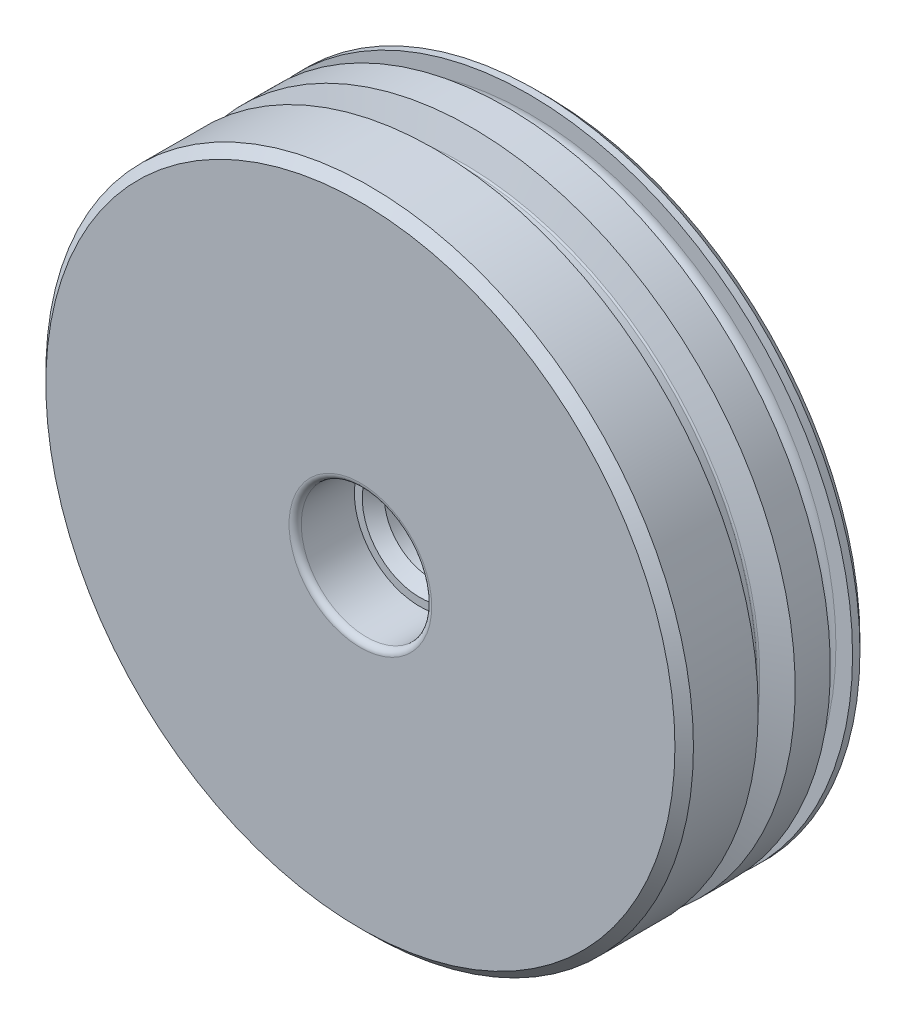
ISO-10303-21;
HEADER;
FILE_DESCRIPTION(('STEP AP214'),'2;1');
FILE_NAME('part.step','',(''),(''),'','','');
FILE_SCHEMA(('AUTOMOTIVE_DESIGN { 1 0 10303 214 1 1 1 1 }'));
ENDSEC;
DATA;
#1=APPLICATION_CONTEXT('core data for automotive mechanical design processes');
#2=APPLICATION_PROTOCOL_DEFINITION('international standard','automotive_design',2000,#1);
#3=PRODUCT_CONTEXT('',#1,'mechanical');
#4=PRODUCT('Part','Part','',(#3));
#5=PRODUCT_RELATED_PRODUCT_CATEGORY('part','',(#4));
#6=PRODUCT_DEFINITION_FORMATION('','',#4);
#7=PRODUCT_DEFINITION_CONTEXT('part definition',#1,'design');
#8=PRODUCT_DEFINITION('design','',#6,#7);
#9=PRODUCT_DEFINITION_SHAPE('','',#8);
#10=(LENGTH_UNIT() NAMED_UNIT(*) SI_UNIT(.MILLI.,.METRE.));
#11=(NAMED_UNIT(*) PLANE_ANGLE_UNIT() SI_UNIT($,.RADIAN.));
#12=(NAMED_UNIT(*) SI_UNIT($,.STERADIAN.) SOLID_ANGLE_UNIT());
#13=UNCERTAINTY_MEASURE_WITH_UNIT(LENGTH_MEASURE(1.E-05),#10,'distance_accuracy_value','');
#14=(GEOMETRIC_REPRESENTATION_CONTEXT(3) GLOBAL_UNCERTAINTY_ASSIGNED_CONTEXT((#13)) GLOBAL_UNIT_ASSIGNED_CONTEXT((#10,
#11,#12)) REPRESENTATION_CONTEXT('',''));
#15=CARTESIAN_POINT('',(0.,0.,0.));
#16=DIRECTION('',(0.,0.,1.));
#17=DIRECTION('',(1.,0.,0.));
#18=AXIS2_PLACEMENT_3D('',#15,#16,#17);
#19=CARTESIAN_POINT('',(0.,0.,-5.));
#20=DIRECTION('',(0.,0.,1.));
#21=DIRECTION('',(1.,0.,0.));
#22=AXIS2_PLACEMENT_3D('',#19,#20,#21);
#23=CYLINDRICAL_SURFACE('',#22,17.5);
#24=CARTESIAN_POINT('',(0.,0.,-4.09999999999999));
#25=DIRECTION('',(0.,0.,-1.));
#26=DIRECTION('',(-1.,0.,0.));
#27=AXIS2_PLACEMENT_3D('',#24,#25,#26);
#28=CIRCLE('',#27,17.5);
#29=CARTESIAN_POINT('',(-17.5,0.,-4.09999999999999));
#30=VERTEX_POINT('',#29);
#31=EDGE_CURVE('E176',#30,#30,#28,.T.);
#32=ORIENTED_EDGE('',*,*,#31,.T.);
#33=EDGE_LOOP('',(#32));
#34=FACE_BOUND('',#33,.T.);
#35=CARTESIAN_POINT('',(0.,0.,-4.49999999999999));
#36=DIRECTION('',(0.,0.,1.));
#37=DIRECTION('',(1.,0.,0.));
#38=AXIS2_PLACEMENT_3D('',#35,#36,#37);
#39=CIRCLE('',#38,17.5);
#40=CARTESIAN_POINT('',(17.5,0.,-4.49999999999999));
#41=VERTEX_POINT('',#40);
#42=EDGE_CURVE('E203',#41,#41,#39,.T.);
#43=ORIENTED_EDGE('',*,*,#42,.T.);
#44=EDGE_LOOP('',(#43));
#45=FACE_BOUND('',#44,.T.);
#46=ADVANCED_FACE('F34',(#34,#45),#23,.T.);
#47=CARTESIAN_POINT('',(0.,0.,-5.));
#48=DIRECTION('',(0.,0.,1.));
#49=DIRECTION('',(1.,0.,0.));
#50=AXIS2_PLACEMENT_3D('',#47,#48,#49);
#51=CYLINDRICAL_SURFACE('',#50,2.5);
#52=CARTESIAN_POINT('',(0.,0.,-1.2));
#53=DIRECTION('',(0.,0.,-1.));
#54=DIRECTION('',(-1.,0.,0.));
#55=AXIS2_PLACEMENT_3D('',#52,#53,#54);
#56=CIRCLE('',#55,2.5);
#57=CARTESIAN_POINT('',(-2.5,0.,-1.2));
#58=VERTEX_POINT('',#57);
#59=EDGE_CURVE('E224',#58,#58,#56,.T.);
#60=ORIENTED_EDGE('',*,*,#59,.T.);
#61=EDGE_LOOP('',(#60));
#62=FACE_BOUND('',#61,.T.);
#63=CARTESIAN_POINT('',(0.,0.,1.19999999999999));
#64=DIRECTION('',(0.,0.,1.));
#65=DIRECTION('',(1.,0.,0.));
#66=AXIS2_PLACEMENT_3D('',#63,#64,#65);
#67=CIRCLE('',#66,2.5);
#68=CARTESIAN_POINT('',(2.5,0.,1.19999999999999));
#69=VERTEX_POINT('',#68);
#70=EDGE_CURVE('E215',#69,#69,#67,.T.);
#71=ORIENTED_EDGE('',*,*,#70,.T.);
#72=EDGE_LOOP('',(#71));
#73=FACE_BOUND('',#72,.T.);
#74=ADVANCED_FACE('F252',(#62,#73),#51,.F.);
#75=CARTESIAN_POINT('',(0.,0.,4.49999999999999));
#76=DIRECTION('',(0.,0.,1.));
#77=DIRECTION('',(1.,0.,0.));
#78=AXIS2_PLACEMENT_3D('',#75,#76,#77);
#79=CIRCLE('',#78,17.5);
#80=CARTESIAN_POINT('',(17.5,0.,4.49999999999999));
#81=VERTEX_POINT('',#80);
#82=EDGE_CURVE('E212',#81,#81,#79,.F.);
#83=ORIENTED_EDGE('',*,*,#82,.T.);
#84=EDGE_LOOP('',(#83));
#85=FACE_BOUND('',#84,.T.);
#86=CARTESIAN_POINT('',(0.,0.,1.));
#87=DIRECTION('',(0.,0.,-1.));
#88=DIRECTION('',(-1.,0.,0.));
#89=AXIS2_PLACEMENT_3D('',#86,#87,#88);
#90=CIRCLE('',#89,17.5);
#91=CARTESIAN_POINT('',(-17.5,0.,1.));
#92=VERTEX_POINT('',#91);
#93=EDGE_CURVE('E200',#92,#92,#90,.T.);
#94=ORIENTED_EDGE('',*,*,#93,.F.);
#95=EDGE_LOOP('',(#94));
#96=FACE_BOUND('',#95,.T.);
#97=ADVANCED_FACE('F255',(#85,#96),#23,.T.);
#98=CARTESIAN_POINT('',(0.,0.,5.));
#99=DIRECTION('',(0.,0.,1.));
#100=DIRECTION('',(1.,0.,0.));
#101=AXIS2_PLACEMENT_3D('',#98,#99,#100);
#102=PLANE('',#101);
#103=CARTESIAN_POINT('',(0.,0.,5.));
#104=DIRECTION('',(0.,0.,1.));
#105=DIRECTION('',(1.,0.,0.));
#106=AXIS2_PLACEMENT_3D('',#103,#104,#105);
#107=CIRCLE('',#106,3.855);
#108=CARTESIAN_POINT('',(3.855,0.,5.));
#109=VERTEX_POINT('',#108);
#110=EDGE_CURVE('E230',#109,#109,#107,.F.);
#111=ORIENTED_EDGE('',*,*,#110,.T.);
#112=EDGE_LOOP('',(#111));
#113=FACE_BOUND('',#112,.T.);
#114=CARTESIAN_POINT('',(0.,0.,5.));
#115=DIRECTION('',(0.,0.,1.));
#116=DIRECTION('',(1.,0.,0.));
#117=AXIS2_PLACEMENT_3D('',#114,#115,#116);
#118=CIRCLE('',#117,17.);
#119=CARTESIAN_POINT('',(17.,0.,5.));
#120=VERTEX_POINT('',#119);
#121=EDGE_CURVE('E209',#120,#120,#118,.T.);
#122=ORIENTED_EDGE('',*,*,#121,.T.);
#123=EDGE_LOOP('',(#122));
#124=FACE_BOUND('',#123,.T.);
#125=ADVANCED_FACE('F266',(#113,#124),#102,.T.);
#126=CARTESIAN_POINT('',(0.,0.,1.));
#127=DIRECTION('',(0.,0.,1.));
#128=DIRECTION('',(1.,0.,0.));
#129=AXIS2_PLACEMENT_3D('',#126,#127,#128);
#130=CONICAL_SURFACE('',#129,17.5,1.24904577239826);
#131=CARTESIAN_POINT('',(0.,0.,0.522792407799439));
#132=DIRECTION('',(0.,0.,-1.));
#133=DIRECTION('',(-1.,0.,0.));
#134=AXIS2_PLACEMENT_3D('',#131,#132,#133);
#135=CIRCLE('',#134,16.0683772233983);
#136=CARTESIAN_POINT('',(-16.0683772233983,0.,0.522792407799439));
#137=VERTEX_POINT('',#136);
#138=EDGE_CURVE('E197',#137,#137,#135,.T.);
#139=ORIENTED_EDGE('',*,*,#138,.F.);
#140=EDGE_LOOP('',(#139));
#141=FACE_BOUND('',#140,.T.);
#142=ORIENTED_EDGE('',*,*,#93,.T.);
#143=EDGE_LOOP('',(#142));
#144=FACE_BOUND('',#143,.T.);
#145=ADVANCED_FACE('F304',(#141,#144),#130,.T.);
#146=CARTESIAN_POINT('',(0.,0.,0.427924077994387));
#147=DIRECTION('',(0.,0.,-1.));
#148=DIRECTION('',(-1.,0.,0.));
#149=AXIS2_PLACEMENT_3D('',#146,#147,#148);
#150=TOROIDAL_SURFACE('',#149,16.1,0.1);
#151=CARTESIAN_POINT('',(0.,0.,0.427924077994387));
#152=DIRECTION('',(0.,0.,-1.));
#153=DIRECTION('',(-1.,0.,0.));
#154=AXIS2_PLACEMENT_3D('',#151,#152,#153);
#155=CIRCLE('',#154,16.);
#156=CARTESIAN_POINT('',(-16.,0.,0.427924077994387));
#157=VERTEX_POINT('',#156);
#158=EDGE_CURVE('E194',#157,#157,#155,.T.);
#159=ORIENTED_EDGE('',*,*,#158,.F.);
#160=EDGE_LOOP('',(#159));
#161=FACE_BOUND('',#160,.T.);
#162=ORIENTED_EDGE('',*,*,#138,.T.);
#163=EDGE_LOOP('',(#162));
#164=FACE_BOUND('',#163,.T.);
#165=ADVANCED_FACE('F298',(#161,#164),#150,.F.);
#166=CARTESIAN_POINT('',(0.,0.,-0.35));
#167=DIRECTION('',(0.,0.,-1.));
#168=DIRECTION('',(-1.,0.,0.));
#169=AXIS2_PLACEMENT_3D('',#166,#167,#168);
#170=CYLINDRICAL_SURFACE('',#169,16.);
#171=CARTESIAN_POINT('',(0.,0.,-0.427924077994387));
#172=DIRECTION('',(0.,0.,-1.));
#173=DIRECTION('',(-1.,0.,0.));
#174=AXIS2_PLACEMENT_3D('',#171,#172,#173);
#175=CIRCLE('',#174,16.);
#176=CARTESIAN_POINT('',(-16.,0.,-0.427924077994387));
#177=VERTEX_POINT('',#176);
#178=EDGE_CURVE('E191',#177,#177,#175,.T.);
#179=ORIENTED_EDGE('',*,*,#178,.F.);
#180=EDGE_LOOP('',(#179));
#181=FACE_BOUND('',#180,.T.);
#182=ORIENTED_EDGE('',*,*,#158,.T.);
#183=EDGE_LOOP('',(#182));
#184=FACE_BOUND('',#183,.T.);
#185=ADVANCED_FACE('F292',(#181,#184),#170,.T.);
#186=CARTESIAN_POINT('',(0.,0.,-0.427924077994387));
#187=DIRECTION('',(0.,0.,-1.));
#188=DIRECTION('',(-1.,0.,0.));
#189=AXIS2_PLACEMENT_3D('',#186,#187,#188);
#190=TOROIDAL_SURFACE('',#189,16.1,0.1);
#191=CARTESIAN_POINT('',(0.,0.,-0.522792407799438));
#192=DIRECTION('',(0.,0.,-1.));
#193=DIRECTION('',(-1.,0.,0.));
#194=AXIS2_PLACEMENT_3D('',#191,#192,#193);
#195=CIRCLE('',#194,16.0683772233983);
#196=CARTESIAN_POINT('',(-16.0683772233983,0.,-0.522792407799438));
#197=VERTEX_POINT('',#196);
#198=EDGE_CURVE('E188',#197,#197,#195,.T.);
#199=ORIENTED_EDGE('',*,*,#198,.F.);
#200=EDGE_LOOP('',(#199));
#201=FACE_BOUND('',#200,.T.);
#202=ORIENTED_EDGE('',*,*,#178,.T.);
#203=EDGE_LOOP('',(#202));
#204=FACE_BOUND('',#203,.T.);
#205=ADVANCED_FACE('F286',(#201,#204),#190,.F.);
#206=CARTESIAN_POINT('',(0.,0.,-0.522792407799438));
#207=DIRECTION('',(0.,0.,-1.));
#208=DIRECTION('',(-1.,0.,0.));
#209=AXIS2_PLACEMENT_3D('',#206,#207,#208);
#210=CONICAL_SURFACE('',#209,16.0683772233983,1.24904577239825);
#211=CARTESIAN_POINT('',(0.,0.,-1.));
#212=DIRECTION('',(0.,0.,-1.));
#213=DIRECTION('',(-1.,0.,0.));
#214=AXIS2_PLACEMENT_3D('',#211,#212,#213);
#215=CIRCLE('',#214,17.5);
#216=CARTESIAN_POINT('',(-17.5,0.,-1.));
#217=VERTEX_POINT('',#216);
#218=EDGE_CURVE('E185',#217,#217,#215,.T.);
#219=ORIENTED_EDGE('',*,*,#218,.F.);
#220=EDGE_LOOP('',(#219));
#221=FACE_BOUND('',#220,.T.);
#222=ORIENTED_EDGE('',*,*,#198,.T.);
#223=EDGE_LOOP('',(#222));
#224=FACE_BOUND('',#223,.T.);
#225=ADVANCED_FACE('F278',(#221,#224),#210,.T.);
#226=CARTESIAN_POINT('',(0.,0.,-5.));
#227=DIRECTION('',(0.,0.,1.));
#228=DIRECTION('',(1.,0.,0.));
#229=AXIS2_PLACEMENT_3D('',#226,#227,#228);
#230=PLANE('',#229);
#231=DIRECTION('',(-1.,0.,0.));
#232=VECTOR('',#231,1.);
#233=CARTESIAN_POINT('',(4.45,-1.55,-5.));
#234=LINE('',#233,#232);
#235=CARTESIAN_POINT('',(7.55,-1.55,-5.));
#236=VERTEX_POINT('',#235);
#237=CARTESIAN_POINT('',(4.45,-1.55,-5.));
#238=VERTEX_POINT('',#237);
#239=EDGE_CURVE('E128',#236,#238,#234,.T.);
#240=ORIENTED_EDGE('',*,*,#239,.F.);
#241=DIRECTION('',(0.,-1.,0.));
#242=VECTOR('',#241,1.);
#243=CARTESIAN_POINT('',(7.55,1.55,-5.));
#244=LINE('',#243,#242);
#245=CARTESIAN_POINT('',(7.55,1.55,-5.));
#246=VERTEX_POINT('',#245);
#247=EDGE_CURVE('E49',#246,#236,#244,.T.);
#248=ORIENTED_EDGE('',*,*,#247,.F.);
#249=DIRECTION('',(1.,0.,0.));
#250=VECTOR('',#249,1.);
#251=CARTESIAN_POINT('',(4.45,1.55,-5.));
#252=LINE('',#251,#250);
#253=CARTESIAN_POINT('',(4.45,1.55,-5.));
#254=VERTEX_POINT('',#253);
#255=EDGE_CURVE('E119',#254,#246,#252,.T.);
#256=ORIENTED_EDGE('',*,*,#255,.F.);
#257=DIRECTION('',(0.,1.,0.));
#258=VECTOR('',#257,1.);
#259=CARTESIAN_POINT('',(4.45,1.55,-5.));
#260=LINE('',#259,#258);
#261=EDGE_CURVE('E122',#238,#254,#260,.T.);
#262=ORIENTED_EDGE('',*,*,#261,.F.);
#263=EDGE_LOOP('',(#240,#248,#256,#262));
#264=FACE_BOUND('',#263,.T.);
#265=DIRECTION('',(-1.,0.,0.));
#266=VECTOR('',#265,1.);
#267=CARTESIAN_POINT('',(-7.55,-1.55,-5.));
#268=LINE('',#267,#266);
#269=CARTESIAN_POINT('',(-4.45,-1.55,-5.));
#270=VERTEX_POINT('',#269);
#271=CARTESIAN_POINT('',(-7.55,-1.55,-5.));
#272=VERTEX_POINT('',#271);
#273=EDGE_CURVE('E152',#270,#272,#268,.T.);
#274=ORIENTED_EDGE('',*,*,#273,.F.);
#275=DIRECTION('',(0.,-1.,0.));
#276=VECTOR('',#275,1.);
#277=CARTESIAN_POINT('',(-4.45,1.55,-5.));
#278=LINE('',#277,#276);
#279=CARTESIAN_POINT('',(-4.45,1.55,-5.));
#280=VERTEX_POINT('',#279);
#281=EDGE_CURVE('E57',#280,#270,#278,.T.);
#282=ORIENTED_EDGE('',*,*,#281,.F.);
#283=DIRECTION('',(1.,0.,0.));
#284=VECTOR('',#283,1.);
#285=CARTESIAN_POINT('',(-7.55,1.55,-5.));
#286=LINE('',#285,#284);
#287=CARTESIAN_POINT('',(-7.55,1.55,-5.));
#288=VERTEX_POINT('',#287);
#289=EDGE_CURVE('E141',#288,#280,#286,.T.);
#290=ORIENTED_EDGE('',*,*,#289,.F.);
#291=DIRECTION('',(0.,1.,0.));
#292=VECTOR('',#291,1.);
#293=CARTESIAN_POINT('',(-7.55,1.55,-5.));
#294=LINE('',#293,#292);
#295=EDGE_CURVE('E155',#272,#288,#294,.T.);
#296=ORIENTED_EDGE('',*,*,#295,.F.);
#297=EDGE_LOOP('',(#274,#282,#290,#296));
#298=FACE_BOUND('',#297,.T.);
#299=CARTESIAN_POINT('',(0.,0.,-5.));
#300=DIRECTION('',(0.,0.,1.));
#301=DIRECTION('',(1.,0.,0.));
#302=AXIS2_PLACEMENT_3D('',#299,#300,#301);
#303=CIRCLE('',#302,3.855);
#304=CARTESIAN_POINT('',(3.855,0.,-5.));
#305=VERTEX_POINT('',#304);
#306=EDGE_CURVE('E42',#305,#305,#303,.T.);
#307=ORIENTED_EDGE('',*,*,#306,.T.);
#308=EDGE_LOOP('',(#307));
#309=FACE_BOUND('',#308,.T.);
#310=CARTESIAN_POINT('',(0.,0.,-5.));
#311=DIRECTION('',(0.,0.,1.));
#312=DIRECTION('',(1.,0.,0.));
#313=AXIS2_PLACEMENT_3D('',#310,#311,#312);
#314=CIRCLE('',#313,17.);
#315=CARTESIAN_POINT('',(17.,0.,-5.));
#316=VERTEX_POINT('',#315);
#317=EDGE_CURVE('E206',#316,#316,#314,.F.);
#318=ORIENTED_EDGE('',*,*,#317,.T.);
#319=EDGE_LOOP('',(#318));
#320=FACE_BOUND('',#319,.T.);
#321=ADVANCED_FACE('F235',(#264,#298,#309,#320),#230,.F.);
#322=CARTESIAN_POINT('',(0.,0.,-2.89999999999999));
#323=DIRECTION('',(0.,0.,-1.));
#324=DIRECTION('',(-1.,0.,0.));
#325=AXIS2_PLACEMENT_3D('',#322,#323,#324);
#326=CIRCLE('',#325,17.5);
#327=CARTESIAN_POINT('',(-17.5,0.,-2.89999999999999));
#328=VERTEX_POINT('',#327);
#329=EDGE_CURVE('E173',#328,#328,#326,.T.);
#330=ORIENTED_EDGE('',*,*,#329,.F.);
#331=EDGE_LOOP('',(#330));
#332=FACE_BOUND('',#331,.T.);
#333=ORIENTED_EDGE('',*,*,#218,.T.);
#334=EDGE_LOOP('',(#333));
#335=FACE_BOUND('',#334,.T.);
#336=ADVANCED_FACE('F256',(#332,#335),#23,.T.);
#337=CARTESIAN_POINT('',(0.,0.,1.8));
#338=DIRECTION('',(0.,0.,1.));
#339=DIRECTION('',(1.,0.,0.));
#340=AXIS2_PLACEMENT_3D('',#337,#338,#339);
#341=CYLINDRICAL_SURFACE('',#340,3.525);
#342=CARTESIAN_POINT('',(0.,0.,4.67));
#343=DIRECTION('',(0.,0.,1.));
#344=DIRECTION('',(1.,0.,0.));
#345=AXIS2_PLACEMENT_3D('',#342,#343,#344);
#346=CIRCLE('',#345,3.525);
#347=CARTESIAN_POINT('',(3.525,0.,4.67));
#348=VERTEX_POINT('',#347);
#349=EDGE_CURVE('E227',#348,#348,#346,.T.);
#350=ORIENTED_EDGE('',*,*,#349,.T.);
#351=EDGE_LOOP('',(#350));
#352=FACE_BOUND('',#351,.T.);
#353=CARTESIAN_POINT('',(0.,0.,1.8));
#354=DIRECTION('',(0.,0.,1.));
#355=DIRECTION('',(1.,0.,0.));
#356=AXIS2_PLACEMENT_3D('',#353,#354,#355);
#357=CIRCLE('',#356,3.525);
#358=CARTESIAN_POINT('',(3.525,0.,1.8));
#359=VERTEX_POINT('',#358);
#360=EDGE_CURVE('E182',#359,#359,#357,.T.);
#361=ORIENTED_EDGE('',*,*,#360,.F.);
#362=EDGE_LOOP('',(#361));
#363=FACE_BOUND('',#362,.T.);
#364=ADVANCED_FACE('F269',(#352,#363),#341,.F.);
#365=CARTESIAN_POINT('',(0.,0.,1.8));
#366=DIRECTION('',(0.,0.,1.));
#367=DIRECTION('',(1.,0.,0.));
#368=AXIS2_PLACEMENT_3D('',#365,#366,#367);
#369=PLANE('',#368);
#370=CARTESIAN_POINT('',(0.,0.,1.8));
#371=DIRECTION('',(0.,0.,1.));
#372=DIRECTION('',(1.,0.,0.));
#373=AXIS2_PLACEMENT_3D('',#370,#371,#372);
#374=CIRCLE('',#373,3.10000000000001);
#375=CARTESIAN_POINT('',(3.10000000000001,0.,1.8));
#376=VERTEX_POINT('',#375);
#377=EDGE_CURVE('E218',#376,#376,#374,.F.);
#378=ORIENTED_EDGE('',*,*,#377,.T.);
#379=EDGE_LOOP('',(#378));
#380=FACE_BOUND('',#379,.T.);
#381=ORIENTED_EDGE('',*,*,#360,.T.);
#382=EDGE_LOOP('',(#381));
#383=FACE_BOUND('',#382,.T.);
#384=ADVANCED_FACE('F275',(#380,#383),#369,.T.);
#385=CARTESIAN_POINT('',(0.,0.,-4.49999999999999));
#386=DIRECTION('',(0.,0.,1.));
#387=DIRECTION('',(1.,0.,0.));
#388=AXIS2_PLACEMENT_3D('',#385,#386,#387);
#389=CONICAL_SURFACE('',#388,17.5,0.785398163397448);
#390=ORIENTED_EDGE('',*,*,#317,.F.);
#391=EDGE_LOOP('',(#390));
#392=FACE_BOUND('',#391,.T.);
#393=ORIENTED_EDGE('',*,*,#42,.F.);
#394=EDGE_LOOP('',(#393));
#395=FACE_BOUND('',#394,.T.);
#396=ADVANCED_FACE('F320',(#392,#395),#389,.T.);
#397=CARTESIAN_POINT('',(0.,0.,5.));
#398=DIRECTION('',(0.,0.,-1.));
#399=DIRECTION('',(-1.,0.,0.));
#400=AXIS2_PLACEMENT_3D('',#397,#398,#399);
#401=CONICAL_SURFACE('',#400,17.,0.785398163397441);
#402=ORIENTED_EDGE('',*,*,#82,.F.);
#403=EDGE_LOOP('',(#402));
#404=FACE_BOUND('',#403,.T.);
#405=ORIENTED_EDGE('',*,*,#121,.F.);
#406=EDGE_LOOP('',(#405));
#407=FACE_BOUND('',#406,.T.);
#408=ADVANCED_FACE('F503',(#404,#407),#401,.T.);
#409=CARTESIAN_POINT('',(0.,0.,1.19999999999999));
#410=DIRECTION('',(0.,0.,1.));
#411=DIRECTION('',(1.,0.,0.));
#412=AXIS2_PLACEMENT_3D('',#409,#410,#411);
#413=CONICAL_SURFACE('',#412,2.5,0.785398163397452);
#414=ORIENTED_EDGE('',*,*,#377,.F.);
#415=EDGE_LOOP('',(#414));
#416=FACE_BOUND('',#415,.T.);
#417=ORIENTED_EDGE('',*,*,#70,.F.);
#418=EDGE_LOOP('',(#417));
#419=FACE_BOUND('',#418,.T.);
#420=ADVANCED_FACE('F331',(#416,#419),#413,.F.);
#421=CARTESIAN_POINT('',(0.,0.,-1.8));
#422=DIRECTION('',(0.,0.,-1.));
#423=DIRECTION('',(1.,0.,0.));
#424=AXIS2_PLACEMENT_3D('',#421,#422,#423);
#425=PLANE('',#424);
#426=CARTESIAN_POINT('',(0.,0.,-1.8));
#427=DIRECTION('',(0.,0.,-1.));
#428=DIRECTION('',(-1.,0.,0.));
#429=AXIS2_PLACEMENT_3D('',#426,#427,#428);
#430=CIRCLE('',#429,3.10000000000001);
#431=CARTESIAN_POINT('',(-3.10000000000001,0.,-1.8));
#432=VERTEX_POINT('',#431);
#433=EDGE_CURVE('E221',#432,#432,#430,.F.);
#434=ORIENTED_EDGE('',*,*,#433,.T.);
#435=EDGE_LOOP('',(#434));
#436=FACE_BOUND('',#435,.T.);
#437=CARTESIAN_POINT('',(0.,0.,-1.8));
#438=DIRECTION('',(0.,0.,1.));
#439=DIRECTION('',(1.,0.,0.));
#440=AXIS2_PLACEMENT_3D('',#437,#438,#439);
#441=CIRCLE('',#440,3.525);
#442=CARTESIAN_POINT('',(3.525,0.,-1.8));
#443=VERTEX_POINT('',#442);
#444=EDGE_CURVE('E179',#443,#443,#441,.T.);
#445=ORIENTED_EDGE('',*,*,#444,.F.);
#446=EDGE_LOOP('',(#445));
#447=FACE_BOUND('',#446,.T.);
#448=ADVANCED_FACE('F327',(#436,#447),#425,.T.);
#449=CARTESIAN_POINT('',(0.,0.,-1.8));
#450=DIRECTION('',(0.,0.,-1.));
#451=DIRECTION('',(-1.,0.,0.));
#452=AXIS2_PLACEMENT_3D('',#449,#450,#451);
#453=CYLINDRICAL_SURFACE('',#452,3.525);
#454=CARTESIAN_POINT('',(0.,0.,-4.67));
#455=DIRECTION('',(0.,0.,1.));
#456=DIRECTION('',(1.,0.,0.));
#457=AXIS2_PLACEMENT_3D('',#454,#455,#456);
#458=CIRCLE('',#457,3.525);
#459=CARTESIAN_POINT('',(3.525,0.,-4.67));
#460=VERTEX_POINT('',#459);
#461=EDGE_CURVE('E11',#460,#460,#458,.F.);
#462=ORIENTED_EDGE('',*,*,#461,.T.);
#463=EDGE_LOOP('',(#462));
#464=FACE_BOUND('',#463,.T.);
#465=ORIENTED_EDGE('',*,*,#444,.T.);
#466=EDGE_LOOP('',(#465));
#467=FACE_BOUND('',#466,.T.);
#468=ADVANCED_FACE('F323',(#464,#467),#453,.F.);
#469=CARTESIAN_POINT('',(0.,0.,-1.8));
#470=DIRECTION('',(0.,0.,-1.));
#471=DIRECTION('',(-1.,0.,0.));
#472=AXIS2_PLACEMENT_3D('',#469,#470,#471);
#473=CONICAL_SURFACE('',#472,3.10000000000001,0.785398163397454);
#474=ORIENTED_EDGE('',*,*,#59,.F.);
#475=EDGE_LOOP('',(#474));
#476=FACE_BOUND('',#475,.T.);
#477=ORIENTED_EDGE('',*,*,#433,.F.);
#478=EDGE_LOOP('',(#477));
#479=FACE_BOUND('',#478,.T.);
#480=ADVANCED_FACE('F326',(#476,#479),#473,.F.);
#481=CARTESIAN_POINT('',(0.,17.5,-4.09999999999999));
#482=DIRECTION('',(0.,0.,-1.));
#483=DIRECTION('',(-1.,0.,0.));
#484=AXIS2_PLACEMENT_3D('',#481,#482,#483);
#485=PLANE('',#484);
#486=ORIENTED_EDGE('',*,*,#31,.F.);
#487=EDGE_LOOP('',(#486));
#488=FACE_BOUND('',#487,.T.);
#489=CARTESIAN_POINT('',(0.,0.,-4.09999999999999));
#490=DIRECTION('',(0.,0.,-1.));
#491=DIRECTION('',(-1.,0.,0.));
#492=AXIS2_PLACEMENT_3D('',#489,#490,#491);
#493=CIRCLE('',#492,16.6);
#494=CARTESIAN_POINT('',(-16.6,0.,-4.09999999999999));
#495=VERTEX_POINT('',#494);
#496=EDGE_CURVE('E162',#495,#495,#493,.T.);
#497=ORIENTED_EDGE('',*,*,#496,.T.);
#498=EDGE_LOOP('',(#497));
#499=FACE_BOUND('',#498,.T.);
#500=ADVANCED_FACE('F333',(#488,#499),#485,.F.);
#501=CARTESIAN_POINT('',(0.,16.6,-2.89999999999999));
#502=DIRECTION('',(0.,0.,1.));
#503=DIRECTION('',(1.,0.,0.));
#504=AXIS2_PLACEMENT_3D('',#501,#502,#503);
#505=PLANE('',#504);
#506=CARTESIAN_POINT('',(0.,0.,-2.89999999999999));
#507=DIRECTION('',(0.,0.,-1.));
#508=DIRECTION('',(-1.,0.,0.));
#509=AXIS2_PLACEMENT_3D('',#506,#507,#508);
#510=CIRCLE('',#509,16.6);
#511=CARTESIAN_POINT('',(-16.6,0.,-2.89999999999999));
#512=VERTEX_POINT('',#511);
#513=EDGE_CURVE('E170',#512,#512,#510,.T.);
#514=ORIENTED_EDGE('',*,*,#513,.F.);
#515=EDGE_LOOP('',(#514));
#516=FACE_BOUND('',#515,.T.);
#517=ORIENTED_EDGE('',*,*,#329,.T.);
#518=EDGE_LOOP('',(#517));
#519=FACE_BOUND('',#518,.T.);
#520=ADVANCED_FACE('F336',(#516,#519),#505,.F.);
#521=CARTESIAN_POINT('',(0.,0.,-3.49999999999999));
#522=DIRECTION('',(0.,0.,-1.));
#523=DIRECTION('',(-1.,0.,0.));
#524=AXIS2_PLACEMENT_3D('',#521,#522,#523);
#525=TOROIDAL_SURFACE('',#524,16.6,0.599999999999999);
#526=ORIENTED_EDGE('',*,*,#496,.F.);
#527=EDGE_LOOP('',(#526));
#528=FACE_BOUND('',#527,.T.);
#529=ORIENTED_EDGE('',*,*,#513,.T.);
#530=EDGE_LOOP('',(#529));
#531=FACE_BOUND('',#530,.T.);
#532=ADVANCED_FACE('F248',(#528,#531),#525,.F.);
#533=CARTESIAN_POINT('',(0.,0.,4.67));
#534=DIRECTION('',(0.,0.,1.));
#535=DIRECTION('',(1.,0.,0.));
#536=AXIS2_PLACEMENT_3D('',#533,#534,#535);
#537=TOROIDAL_SURFACE('',#536,3.855,0.33);
#538=ORIENTED_EDGE('',*,*,#110,.F.);
#539=EDGE_LOOP('',(#538));
#540=FACE_BOUND('',#539,.T.);
#541=ORIENTED_EDGE('',*,*,#349,.F.);
#542=EDGE_LOOP('',(#541));
#543=FACE_BOUND('',#542,.T.);
#544=ADVANCED_FACE('F240',(#540,#543),#537,.T.);
#545=CARTESIAN_POINT('',(0.,0.,-4.67));
#546=DIRECTION('',(0.,0.,1.));
#547=DIRECTION('',(1.,0.,0.));
#548=AXIS2_PLACEMENT_3D('',#545,#546,#547);
#549=TOROIDAL_SURFACE('',#548,3.855,0.33);
#550=ORIENTED_EDGE('',*,*,#461,.F.);
#551=EDGE_LOOP('',(#550));
#552=FACE_BOUND('',#551,.T.);
#553=ORIENTED_EDGE('',*,*,#306,.F.);
#554=EDGE_LOOP('',(#553));
#555=FACE_BOUND('',#554,.T.);
#556=ADVANCED_FACE('F36',(#552,#555),#549,.T.);
#557=CARTESIAN_POINT('',(-4.45,1.55,-1.));
#558=DIRECTION('',(1.,0.,0.));
#559=DIRECTION('',(0.,0.,-1.));
#560=AXIS2_PLACEMENT_3D('',#557,#558,#559);
#561=PLANE('',#560);
#562=ORIENTED_EDGE('',*,*,#281,.T.);
#563=DIRECTION('',(0.,0.,-1.));
#564=VECTOR('',#563,1.);
#565=CARTESIAN_POINT('',(-4.45,-1.55,-1.));
#566=LINE('',#565,#564);
#567=CARTESIAN_POINT('',(-4.45,-1.55,-1.));
#568=VERTEX_POINT('',#567);
#569=EDGE_CURVE('E150',#568,#270,#566,.T.);
#570=ORIENTED_EDGE('',*,*,#569,.F.);
#571=DIRECTION('',(0.,-1.,0.));
#572=VECTOR('',#571,1.);
#573=CARTESIAN_POINT('',(-4.45,1.55,-1.));
#574=LINE('',#573,#572);
#575=CARTESIAN_POINT('',(-4.45,1.55,-1.));
#576=VERTEX_POINT('',#575);
#577=EDGE_CURVE('E137',#576,#568,#574,.T.);
#578=ORIENTED_EDGE('',*,*,#577,.F.);
#579=DIRECTION('',(0.,0.,-1.));
#580=VECTOR('',#579,1.);
#581=CARTESIAN_POINT('',(-4.45,1.55,-1.));
#582=LINE('',#581,#580);
#583=EDGE_CURVE('E160',#576,#280,#582,.T.);
#584=ORIENTED_EDGE('',*,*,#583,.T.);
#585=EDGE_LOOP('',(#562,#570,#578,#584));
#586=FACE_BOUND('',#585,.T.);
#587=ADVANCED_FACE('F239',(#586),#561,.F.);
#588=CARTESIAN_POINT('',(-7.55,1.55,-1.));
#589=DIRECTION('',(0.,1.,0.));
#590=DIRECTION('',(-1.,0.,0.));
#591=AXIS2_PLACEMENT_3D('',#588,#589,#590);
#592=PLANE('',#591);
#593=ORIENTED_EDGE('',*,*,#289,.T.);
#594=ORIENTED_EDGE('',*,*,#583,.F.);
#595=DIRECTION('',(1.,0.,0.));
#596=VECTOR('',#595,1.);
#597=CARTESIAN_POINT('',(-7.55,1.55,-1.));
#598=LINE('',#597,#596);
#599=CARTESIAN_POINT('',(-7.55,1.55,-1.));
#600=VERTEX_POINT('',#599);
#601=EDGE_CURVE('E147',#600,#576,#598,.T.);
#602=ORIENTED_EDGE('',*,*,#601,.F.);
#603=DIRECTION('',(0.,0.,-1.));
#604=VECTOR('',#603,1.);
#605=CARTESIAN_POINT('',(-7.55,1.55,-1.));
#606=LINE('',#605,#604);
#607=EDGE_CURVE('E163',#600,#288,#606,.T.);
#608=ORIENTED_EDGE('',*,*,#607,.T.);
#609=EDGE_LOOP('',(#593,#594,#602,#608));
#610=FACE_BOUND('',#609,.T.);
#611=ADVANCED_FACE('F246',(#610),#592,.F.);
#612=CARTESIAN_POINT('',(-7.55,1.55,-1.));
#613=DIRECTION('',(-1.,0.,0.));
#614=DIRECTION('',(0.,0.,1.));
#615=AXIS2_PLACEMENT_3D('',#612,#613,#614);
#616=PLANE('',#615);
#617=ORIENTED_EDGE('',*,*,#295,.T.);
#618=ORIENTED_EDGE('',*,*,#607,.F.);
#619=DIRECTION('',(0.,1.,0.));
#620=VECTOR('',#619,1.);
#621=CARTESIAN_POINT('',(-7.55,1.55,-1.));
#622=LINE('',#621,#620);
#623=CARTESIAN_POINT('',(-7.55,-1.55,-1.));
#624=VERTEX_POINT('',#623);
#625=EDGE_CURVE('E144',#624,#600,#622,.T.);
#626=ORIENTED_EDGE('',*,*,#625,.F.);
#627=DIRECTION('',(0.,0.,-1.));
#628=VECTOR('',#627,1.);
#629=CARTESIAN_POINT('',(-7.55,-1.55,-1.));
#630=LINE('',#629,#628);
#631=EDGE_CURVE('E165',#624,#272,#630,.T.);
#632=ORIENTED_EDGE('',*,*,#631,.T.);
#633=EDGE_LOOP('',(#617,#618,#626,#632));
#634=FACE_BOUND('',#633,.T.);
#635=ADVANCED_FACE('F348',(#634),#616,.F.);
#636=CARTESIAN_POINT('',(-7.55,-1.55,-1.));
#637=DIRECTION('',(0.,-1.,0.));
#638=DIRECTION('',(1.,0.,0.));
#639=AXIS2_PLACEMENT_3D('',#636,#637,#638);
#640=PLANE('',#639);
#641=ORIENTED_EDGE('',*,*,#273,.T.);
#642=ORIENTED_EDGE('',*,*,#631,.F.);
#643=DIRECTION('',(-1.,0.,0.));
#644=VECTOR('',#643,1.);
#645=CARTESIAN_POINT('',(-7.55,-1.55,-1.));
#646=LINE('',#645,#644);
#647=EDGE_CURVE('E140',#568,#624,#646,.T.);
#648=ORIENTED_EDGE('',*,*,#647,.F.);
#649=ORIENTED_EDGE('',*,*,#569,.T.);
#650=EDGE_LOOP('',(#641,#642,#648,#649));
#651=FACE_BOUND('',#650,.T.);
#652=ADVANCED_FACE('F344',(#651),#640,.F.);
#653=CARTESIAN_POINT('',(0.,0.,-1.));
#654=DIRECTION('',(0.,0.,1.));
#655=DIRECTION('',(1.,0.,0.));
#656=AXIS2_PLACEMENT_3D('',#653,#654,#655);
#657=PLANE('',#656);
#658=ORIENTED_EDGE('',*,*,#577,.T.);
#659=ORIENTED_EDGE('',*,*,#647,.T.);
#660=ORIENTED_EDGE('',*,*,#625,.T.);
#661=ORIENTED_EDGE('',*,*,#601,.T.);
#662=EDGE_LOOP('',(#658,#659,#660,#661));
#663=FACE_BOUND('',#662,.T.);
#664=ADVANCED_FACE('F347',(#663),#657,.F.);
#665=CARTESIAN_POINT('',(7.55,1.55,-1.));
#666=DIRECTION('',(1.,0.,0.));
#667=DIRECTION('',(0.,0.,-1.));
#668=AXIS2_PLACEMENT_3D('',#665,#666,#667);
#669=PLANE('',#668);
#670=ORIENTED_EDGE('',*,*,#247,.T.);
#671=DIRECTION('',(0.,0.,-1.));
#672=VECTOR('',#671,1.);
#673=CARTESIAN_POINT('',(7.55,-1.55,-1.));
#674=LINE('',#673,#672);
#675=CARTESIAN_POINT('',(7.55,-1.55,-1.));
#676=VERTEX_POINT('',#675);
#677=EDGE_CURVE('E97',#676,#236,#674,.T.);
#678=ORIENTED_EDGE('',*,*,#677,.F.);
#679=DIRECTION('',(0.,-1.,0.));
#680=VECTOR('',#679,1.);
#681=CARTESIAN_POINT('',(7.55,1.55,-1.));
#682=LINE('',#681,#680);
#683=CARTESIAN_POINT('',(7.55,1.55,-1.));
#684=VERTEX_POINT('',#683);
#685=EDGE_CURVE('E101',#684,#676,#682,.T.);
#686=ORIENTED_EDGE('',*,*,#685,.F.);
#687=DIRECTION('',(0.,0.,-1.));
#688=VECTOR('',#687,1.);
#689=CARTESIAN_POINT('',(7.55,1.55,-1.));
#690=LINE('',#689,#688);
#691=EDGE_CURVE('E132',#684,#246,#690,.T.);
#692=ORIENTED_EDGE('',*,*,#691,.T.);
#693=EDGE_LOOP('',(#670,#678,#686,#692));
#694=FACE_BOUND('',#693,.T.);
#695=ADVANCED_FACE('F99',(#694),#669,.F.);
#696=CARTESIAN_POINT('',(4.45,1.55,-1.));
#697=DIRECTION('',(0.,1.,0.));
#698=DIRECTION('',(-1.,0.,0.));
#699=AXIS2_PLACEMENT_3D('',#696,#697,#698);
#700=PLANE('',#699);
#701=ORIENTED_EDGE('',*,*,#255,.T.);
#702=ORIENTED_EDGE('',*,*,#691,.F.);
#703=DIRECTION('',(1.,0.,0.));
#704=VECTOR('',#703,1.);
#705=CARTESIAN_POINT('',(4.45,1.55,-1.));
#706=LINE('',#705,#704);
#707=CARTESIAN_POINT('',(4.45,1.55,-1.));
#708=VERTEX_POINT('',#707);
#709=EDGE_CURVE('E107',#708,#684,#706,.T.);
#710=ORIENTED_EDGE('',*,*,#709,.F.);
#711=DIRECTION('',(0.,0.,-1.));
#712=VECTOR('',#711,1.);
#713=CARTESIAN_POINT('',(4.45,1.55,-1.));
#714=LINE('',#713,#712);
#715=EDGE_CURVE('E134',#708,#254,#714,.T.);
#716=ORIENTED_EDGE('',*,*,#715,.T.);
#717=EDGE_LOOP('',(#701,#702,#710,#716));
#718=FACE_BOUND('',#717,.T.);
#719=ADVANCED_FACE('F361',(#718),#700,.F.);
#720=CARTESIAN_POINT('',(4.45,1.55,-1.));
#721=DIRECTION('',(-1.,0.,0.));
#722=DIRECTION('',(0.,0.,1.));
#723=AXIS2_PLACEMENT_3D('',#720,#721,#722);
#724=PLANE('',#723);
#725=ORIENTED_EDGE('',*,*,#261,.T.);
#726=ORIENTED_EDGE('',*,*,#715,.F.);
#727=DIRECTION('',(0.,1.,0.));
#728=VECTOR('',#727,1.);
#729=CARTESIAN_POINT('',(4.45,1.55,-1.));
#730=LINE('',#729,#728);
#731=CARTESIAN_POINT('',(4.45,-1.55,-1.));
#732=VERTEX_POINT('',#731);
#733=EDGE_CURVE('E115',#732,#708,#730,.T.);
#734=ORIENTED_EDGE('',*,*,#733,.F.);
#735=DIRECTION('',(0.,0.,-1.));
#736=VECTOR('',#735,1.);
#737=CARTESIAN_POINT('',(4.45,-1.55,-1.));
#738=LINE('',#737,#736);
#739=EDGE_CURVE('E106',#732,#238,#738,.T.);
#740=ORIENTED_EDGE('',*,*,#739,.T.);
#741=EDGE_LOOP('',(#725,#726,#734,#740));
#742=FACE_BOUND('',#741,.T.);
#743=ADVANCED_FACE('F364',(#742),#724,.F.);
#744=CARTESIAN_POINT('',(4.45,-1.55,-1.));
#745=DIRECTION('',(0.,-1.,0.));
#746=DIRECTION('',(1.,0.,0.));
#747=AXIS2_PLACEMENT_3D('',#744,#745,#746);
#748=PLANE('',#747);
#749=ORIENTED_EDGE('',*,*,#239,.T.);
#750=ORIENTED_EDGE('',*,*,#739,.F.);
#751=DIRECTION('',(-1.,0.,0.));
#752=VECTOR('',#751,1.);
#753=CARTESIAN_POINT('',(4.45,-1.55,-1.));
#754=LINE('',#753,#752);
#755=EDGE_CURVE('E110',#676,#732,#754,.T.);
#756=ORIENTED_EDGE('',*,*,#755,.F.);
#757=ORIENTED_EDGE('',*,*,#677,.T.);
#758=EDGE_LOOP('',(#749,#750,#756,#757));
#759=FACE_BOUND('',#758,.T.);
#760=ADVANCED_FACE('F111',(#759),#748,.F.);
#761=CARTESIAN_POINT('',(0.,0.,-1.));
#762=DIRECTION('',(0.,0.,1.));
#763=DIRECTION('',(1.,0.,0.));
#764=AXIS2_PLACEMENT_3D('',#761,#762,#763);
#765=PLANE('',#764);
#766=ORIENTED_EDGE('',*,*,#685,.T.);
#767=ORIENTED_EDGE('',*,*,#755,.T.);
#768=ORIENTED_EDGE('',*,*,#733,.T.);
#769=ORIENTED_EDGE('',*,*,#709,.T.);
#770=EDGE_LOOP('',(#766,#767,#768,#769));
#771=FACE_BOUND('',#770,.T.);
#772=ADVANCED_FACE('F117',(#771),#765,.F.);
#773=CLOSED_SHELL('',(#46,#74,#97,#125,#145,#165,#185,#205,#225,#321,#336,#364,#384,#396,#408,
#420,#448,#468,#480,#500,#520,#532,#544,#556,#587,#611,#635,#652,#664,#695,#719,#743,#760,#772));
#774=MANIFOLD_SOLID_BREP('B2',#773);
#775=ADVANCED_BREP_SHAPE_REPRESENTATION('',(#18,#774),#14);
#776=SHAPE_DEFINITION_REPRESENTATION(#9,#775);
ENDSEC;
END-ISO-10303-21;
